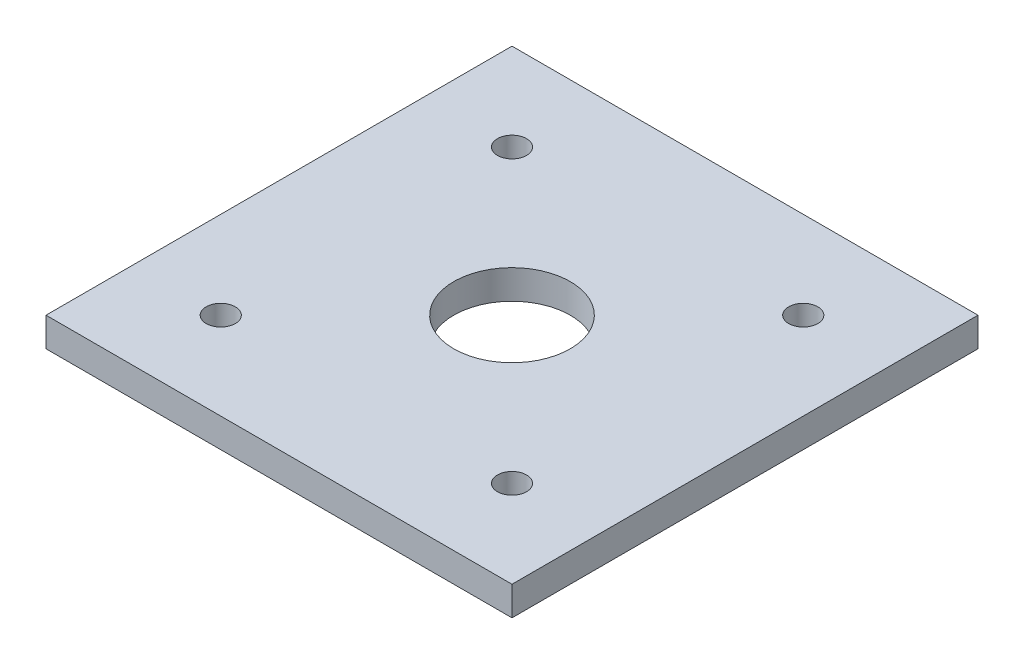
ISO-10303-21;
HEADER;
FILE_DESCRIPTION(('STEP AP214'),'2;1');
FILE_NAME('part.step','',(''),(''),'','','');
FILE_SCHEMA(('AUTOMOTIVE_DESIGN { 1 0 10303 214 1 1 1 1 }'));
ENDSEC;
DATA;
#1=APPLICATION_CONTEXT('core data for automotive mechanical design processes');
#2=APPLICATION_PROTOCOL_DEFINITION('international standard','automotive_design',2000,#1);
#3=PRODUCT_CONTEXT('',#1,'mechanical');
#4=PRODUCT('Part','Part','',(#3));
#5=PRODUCT_RELATED_PRODUCT_CATEGORY('part','',(#4));
#6=PRODUCT_DEFINITION_FORMATION('','',#4);
#7=PRODUCT_DEFINITION_CONTEXT('part definition',#1,'design');
#8=PRODUCT_DEFINITION('design','',#6,#7);
#9=PRODUCT_DEFINITION_SHAPE('','',#8);
#10=(LENGTH_UNIT() NAMED_UNIT(*) SI_UNIT(.MILLI.,.METRE.));
#11=(NAMED_UNIT(*) PLANE_ANGLE_UNIT() SI_UNIT($,.RADIAN.));
#12=(NAMED_UNIT(*) SI_UNIT($,.STERADIAN.) SOLID_ANGLE_UNIT());
#13=UNCERTAINTY_MEASURE_WITH_UNIT(LENGTH_MEASURE(1.E-05),#10,'distance_accuracy_value','');
#14=(GEOMETRIC_REPRESENTATION_CONTEXT(3) GLOBAL_UNCERTAINTY_ASSIGNED_CONTEXT((#13)) GLOBAL_UNIT_ASSIGNED_CONTEXT((#10,
#11,#12)) REPRESENTATION_CONTEXT('',''));
#15=CARTESIAN_POINT('',(0.,0.,0.));
#16=DIRECTION('',(0.,0.,1.));
#17=DIRECTION('',(1.,0.,0.));
#18=AXIS2_PLACEMENT_3D('',#15,#16,#17);
#19=CARTESIAN_POINT('',(0.,6.35,0.));
#20=DIRECTION('',(0.,1.,0.));
#21=DIRECTION('',(0.,0.,1.));
#22=AXIS2_PLACEMENT_3D('',#19,#20,#21);
#23=PLANE('',#22);
#24=CARTESIAN_POINT('',(-31.7500000000003,6.35,-31.7499999999997));
#25=DIRECTION('',(0.,1.,0.));
#26=DIRECTION('',(0.,0.,1.));
#27=AXIS2_PLACEMENT_3D('',#24,#25,#26);
#28=CIRCLE('',#27,3.17499999999999);
#29=CARTESIAN_POINT('',(-31.7500000000003,6.35,-28.5749999999997));
#30=VERTEX_POINT('',#29);
#31=EDGE_CURVE('E137',#30,#30,#28,.T.);
#32=ORIENTED_EDGE('',*,*,#31,.F.);
#33=EDGE_LOOP('',(#32));
#34=FACE_BOUND('',#33,.T.);
#35=CARTESIAN_POINT('',(31.75,6.35,-31.75));
#36=DIRECTION('',(0.,1.,0.));
#37=DIRECTION('',(0.,0.,1.));
#38=AXIS2_PLACEMENT_3D('',#35,#36,#37);
#39=CIRCLE('',#38,3.17499999999998);
#40=CARTESIAN_POINT('',(31.75,6.35,-28.575));
#41=VERTEX_POINT('',#40);
#42=EDGE_CURVE('E131',#41,#41,#39,.T.);
#43=ORIENTED_EDGE('',*,*,#42,.F.);
#44=EDGE_LOOP('',(#43));
#45=FACE_BOUND('',#44,.T.);
#46=CARTESIAN_POINT('',(31.7500000000001,6.35,31.7499999999999));
#47=DIRECTION('',(0.,1.,0.));
#48=DIRECTION('',(0.,0.,1.));
#49=AXIS2_PLACEMENT_3D('',#46,#47,#48);
#50=CIRCLE('',#49,3.17499999999998);
#51=CARTESIAN_POINT('',(31.7500000000001,6.35,34.9249999999999));
#52=VERTEX_POINT('',#51);
#53=EDGE_CURVE('E125',#52,#52,#50,.T.);
#54=ORIENTED_EDGE('',*,*,#53,.F.);
#55=EDGE_LOOP('',(#54));
#56=FACE_BOUND('',#55,.T.);
#57=CARTESIAN_POINT('',(-31.75,6.35,31.75));
#58=DIRECTION('',(0.,1.,0.));
#59=DIRECTION('',(0.,0.,1.));
#60=AXIS2_PLACEMENT_3D('',#57,#58,#59);
#61=CIRCLE('',#60,3.17499999999999);
#62=CARTESIAN_POINT('',(-31.75,6.35,34.925));
#63=VERTEX_POINT('',#62);
#64=EDGE_CURVE('E119',#63,#63,#61,.T.);
#65=ORIENTED_EDGE('',*,*,#64,.F.);
#66=EDGE_LOOP('',(#65));
#67=FACE_BOUND('',#66,.T.);
#68=DIRECTION('',(0.,0.,-1.));
#69=VECTOR('',#68,1.);
#70=CARTESIAN_POINT('',(50.8,6.35,-50.8));
#71=LINE('',#70,#69);
#72=CARTESIAN_POINT('',(50.8,6.35,50.8));
#73=VERTEX_POINT('',#72);
#74=CARTESIAN_POINT('',(50.8,6.35,-50.8));
#75=VERTEX_POINT('',#74);
#76=EDGE_CURVE('E84',#73,#75,#71,.T.);
#77=ORIENTED_EDGE('',*,*,#76,.T.);
#78=DIRECTION('',(-1.,0.,0.));
#79=VECTOR('',#78,1.);
#80=CARTESIAN_POINT('',(-50.8,6.35,-50.8));
#81=LINE('',#80,#79);
#82=CARTESIAN_POINT('',(-50.8,6.35,-50.8));
#83=VERTEX_POINT('',#82);
#84=EDGE_CURVE('E79',#75,#83,#81,.T.);
#85=ORIENTED_EDGE('',*,*,#84,.T.);
#86=DIRECTION('',(0.,0.,1.));
#87=VECTOR('',#86,1.);
#88=CARTESIAN_POINT('',(-50.8,6.35,-50.8));
#89=LINE('',#88,#87);
#90=CARTESIAN_POINT('',(-50.8,6.35,50.8));
#91=VERTEX_POINT('',#90);
#92=EDGE_CURVE('E82',#83,#91,#89,.T.);
#93=ORIENTED_EDGE('',*,*,#92,.T.);
#94=DIRECTION('',(1.,0.,0.));
#95=VECTOR('',#94,1.);
#96=CARTESIAN_POINT('',(-50.8,6.35,50.8));
#97=LINE('',#96,#95);
#98=EDGE_CURVE('E49',#91,#73,#97,.T.);
#99=ORIENTED_EDGE('',*,*,#98,.T.);
#100=EDGE_LOOP('',(#77,#85,#93,#99));
#101=FACE_BOUND('',#100,.T.);
#102=CARTESIAN_POINT('',(0.,6.35,0.));
#103=DIRECTION('',(0.,1.,0.));
#104=DIRECTION('',(0.,0.,1.));
#105=AXIS2_PLACEMENT_3D('',#102,#103,#104);
#106=CIRCLE('',#105,12.7);
#107=CARTESIAN_POINT('',(0.,6.35,12.7));
#108=VERTEX_POINT('',#107);
#109=EDGE_CURVE('E99',#108,#108,#106,.T.);
#110=ORIENTED_EDGE('',*,*,#109,.F.);
#111=EDGE_LOOP('',(#110));
#112=FACE_BOUND('',#111,.T.);
#113=ADVANCED_FACE('F32',(#34,#45,#56,#67,#101,#112),#23,.T.);
#114=CARTESIAN_POINT('',(0.,0.,0.));
#115=DIRECTION('',(0.,1.,0.));
#116=DIRECTION('',(0.,0.,1.));
#117=AXIS2_PLACEMENT_3D('',#114,#115,#116);
#118=PLANE('',#117);
#119=CARTESIAN_POINT('',(-31.7500000000003,0.,-31.7499999999997));
#120=DIRECTION('',(0.,1.,0.));
#121=DIRECTION('',(0.,0.,1.));
#122=AXIS2_PLACEMENT_3D('',#119,#120,#121);
#123=CIRCLE('',#122,3.17499999999999);
#124=CARTESIAN_POINT('',(-31.7500000000003,0.,-28.5749999999997));
#125=VERTEX_POINT('',#124);
#126=EDGE_CURVE('E134',#125,#125,#123,.T.);
#127=ORIENTED_EDGE('',*,*,#126,.T.);
#128=EDGE_LOOP('',(#127));
#129=FACE_BOUND('',#128,.T.);
#130=CARTESIAN_POINT('',(31.75,0.,-31.75));
#131=DIRECTION('',(0.,1.,0.));
#132=DIRECTION('',(0.,0.,1.));
#133=AXIS2_PLACEMENT_3D('',#130,#131,#132);
#134=CIRCLE('',#133,3.17499999999998);
#135=CARTESIAN_POINT('',(31.75,0.,-28.575));
#136=VERTEX_POINT('',#135);
#137=EDGE_CURVE('E128',#136,#136,#134,.T.);
#138=ORIENTED_EDGE('',*,*,#137,.T.);
#139=EDGE_LOOP('',(#138));
#140=FACE_BOUND('',#139,.T.);
#141=CARTESIAN_POINT('',(31.7500000000001,0.,31.7499999999999));
#142=DIRECTION('',(0.,1.,0.));
#143=DIRECTION('',(0.,0.,1.));
#144=AXIS2_PLACEMENT_3D('',#141,#142,#143);
#145=CIRCLE('',#144,3.17499999999998);
#146=CARTESIAN_POINT('',(31.7500000000001,0.,34.9249999999999));
#147=VERTEX_POINT('',#146);
#148=EDGE_CURVE('E122',#147,#147,#145,.T.);
#149=ORIENTED_EDGE('',*,*,#148,.T.);
#150=EDGE_LOOP('',(#149));
#151=FACE_BOUND('',#150,.T.);
#152=CARTESIAN_POINT('',(-31.75,0.,31.75));
#153=DIRECTION('',(0.,1.,0.));
#154=DIRECTION('',(0.,0.,1.));
#155=AXIS2_PLACEMENT_3D('',#152,#153,#154);
#156=CIRCLE('',#155,3.17499999999999);
#157=CARTESIAN_POINT('',(-31.75,0.,34.925));
#158=VERTEX_POINT('',#157);
#159=EDGE_CURVE('E114',#158,#158,#156,.T.);
#160=ORIENTED_EDGE('',*,*,#159,.T.);
#161=EDGE_LOOP('',(#160));
#162=FACE_BOUND('',#161,.T.);
#163=DIRECTION('',(0.,0.,-1.));
#164=VECTOR('',#163,1.);
#165=CARTESIAN_POINT('',(50.8,0.,-50.8));
#166=LINE('',#165,#164);
#167=CARTESIAN_POINT('',(50.8,0.,50.8));
#168=VERTEX_POINT('',#167);
#169=CARTESIAN_POINT('',(50.8,0.,-50.8));
#170=VERTEX_POINT('',#169);
#171=EDGE_CURVE('E96',#168,#170,#166,.T.);
#172=ORIENTED_EDGE('',*,*,#171,.F.);
#173=DIRECTION('',(1.,0.,0.));
#174=VECTOR('',#173,1.);
#175=CARTESIAN_POINT('',(-50.8,0.,50.8));
#176=LINE('',#175,#174);
#177=CARTESIAN_POINT('',(-50.8,0.,50.8));
#178=VERTEX_POINT('',#177);
#179=EDGE_CURVE('E72',#178,#168,#176,.T.);
#180=ORIENTED_EDGE('',*,*,#179,.F.);
#181=DIRECTION('',(0.,0.,1.));
#182=VECTOR('',#181,1.);
#183=CARTESIAN_POINT('',(-50.8,0.,-50.8));
#184=LINE('',#183,#182);
#185=CARTESIAN_POINT('',(-50.8,0.,-50.8));
#186=VERTEX_POINT('',#185);
#187=EDGE_CURVE('E66',#186,#178,#184,.T.);
#188=ORIENTED_EDGE('',*,*,#187,.F.);
#189=DIRECTION('',(-1.,0.,0.));
#190=VECTOR('',#189,1.);
#191=CARTESIAN_POINT('',(-50.8,0.,-50.8));
#192=LINE('',#191,#190);
#193=EDGE_CURVE('E88',#170,#186,#192,.T.);
#194=ORIENTED_EDGE('',*,*,#193,.F.);
#195=EDGE_LOOP('',(#172,#180,#188,#194));
#196=FACE_BOUND('',#195,.T.);
#197=CARTESIAN_POINT('',(0.,0.,0.));
#198=DIRECTION('',(0.,1.,0.));
#199=DIRECTION('',(0.,0.,1.));
#200=AXIS2_PLACEMENT_3D('',#197,#198,#199);
#201=CIRCLE('',#200,12.7);
#202=CARTESIAN_POINT('',(0.,0.,12.7));
#203=VERTEX_POINT('',#202);
#204=EDGE_CURVE('E111',#203,#203,#201,.T.);
#205=ORIENTED_EDGE('',*,*,#204,.T.);
#206=EDGE_LOOP('',(#205));
#207=FACE_BOUND('',#206,.T.);
#208=ADVANCED_FACE('F107',(#129,#140,#151,#162,#196,#207),#118,.F.);
#209=CARTESIAN_POINT('',(50.8,6.35,-50.8));
#210=DIRECTION('',(-1.,0.,0.));
#211=DIRECTION('',(0.,0.,1.));
#212=AXIS2_PLACEMENT_3D('',#209,#210,#211);
#213=PLANE('',#212);
#214=ORIENTED_EDGE('',*,*,#171,.T.);
#215=DIRECTION('',(0.,-1.,0.));
#216=VECTOR('',#215,1.);
#217=CARTESIAN_POINT('',(50.8,6.35,-50.8));
#218=LINE('',#217,#216);
#219=EDGE_CURVE('E11',#75,#170,#218,.T.);
#220=ORIENTED_EDGE('',*,*,#219,.F.);
#221=ORIENTED_EDGE('',*,*,#76,.F.);
#222=DIRECTION('',(0.,-1.,0.));
#223=VECTOR('',#222,1.);
#224=CARTESIAN_POINT('',(50.8,6.35,50.8));
#225=LINE('',#224,#223);
#226=EDGE_CURVE('E92',#73,#168,#225,.T.);
#227=ORIENTED_EDGE('',*,*,#226,.T.);
#228=EDGE_LOOP('',(#214,#220,#221,#227));
#229=FACE_BOUND('',#228,.T.);
#230=ADVANCED_FACE('F34',(#229),#213,.F.);
#231=CARTESIAN_POINT('',(-50.8,6.35,-50.8));
#232=DIRECTION('',(0.,0.,1.));
#233=DIRECTION('',(1.,0.,0.));
#234=AXIS2_PLACEMENT_3D('',#231,#232,#233);
#235=PLANE('',#234);
#236=ORIENTED_EDGE('',*,*,#193,.T.);
#237=DIRECTION('',(0.,-1.,0.));
#238=VECTOR('',#237,1.);
#239=CARTESIAN_POINT('',(-50.8,6.35,-50.8));
#240=LINE('',#239,#238);
#241=EDGE_CURVE('E41',#83,#186,#240,.T.);
#242=ORIENTED_EDGE('',*,*,#241,.F.);
#243=ORIENTED_EDGE('',*,*,#84,.F.);
#244=ORIENTED_EDGE('',*,*,#219,.T.);
#245=EDGE_LOOP('',(#236,#242,#243,#244));
#246=FACE_BOUND('',#245,.T.);
#247=ADVANCED_FACE('F87',(#246),#235,.F.);
#248=CARTESIAN_POINT('',(-50.8,6.35,-50.8));
#249=DIRECTION('',(1.,0.,0.));
#250=DIRECTION('',(0.,0.,-1.));
#251=AXIS2_PLACEMENT_3D('',#248,#249,#250);
#252=PLANE('',#251);
#253=ORIENTED_EDGE('',*,*,#187,.T.);
#254=DIRECTION('',(0.,-1.,0.));
#255=VECTOR('',#254,1.);
#256=CARTESIAN_POINT('',(-50.8,6.35,50.8));
#257=LINE('',#256,#255);
#258=EDGE_CURVE('E89',#91,#178,#257,.T.);
#259=ORIENTED_EDGE('',*,*,#258,.F.);
#260=ORIENTED_EDGE('',*,*,#92,.F.);
#261=ORIENTED_EDGE('',*,*,#241,.T.);
#262=EDGE_LOOP('',(#253,#259,#260,#261));
#263=FACE_BOUND('',#262,.T.);
#264=ADVANCED_FACE('F90',(#263),#252,.F.);
#265=CARTESIAN_POINT('',(-50.8,6.35,50.8));
#266=DIRECTION('',(0.,0.,-1.));
#267=DIRECTION('',(-1.,0.,0.));
#268=AXIS2_PLACEMENT_3D('',#265,#266,#267);
#269=PLANE('',#268);
#270=ORIENTED_EDGE('',*,*,#179,.T.);
#271=ORIENTED_EDGE('',*,*,#226,.F.);
#272=ORIENTED_EDGE('',*,*,#98,.F.);
#273=ORIENTED_EDGE('',*,*,#258,.T.);
#274=EDGE_LOOP('',(#270,#271,#272,#273));
#275=FACE_BOUND('',#274,.T.);
#276=ADVANCED_FACE('F104',(#275),#269,.F.);
#277=CARTESIAN_POINT('',(0.,6.35,0.));
#278=DIRECTION('',(0.,-1.,0.));
#279=DIRECTION('',(0.,0.,-1.));
#280=AXIS2_PLACEMENT_3D('',#277,#278,#279);
#281=CYLINDRICAL_SURFACE('',#280,12.7);
#282=ORIENTED_EDGE('',*,*,#109,.T.);
#283=EDGE_LOOP('',(#282));
#284=FACE_BOUND('',#283,.T.);
#285=ORIENTED_EDGE('',*,*,#204,.F.);
#286=EDGE_LOOP('',(#285));
#287=FACE_BOUND('',#286,.T.);
#288=ADVANCED_FACE('F155',(#284,#287),#281,.F.);
#289=CARTESIAN_POINT('',(-31.75,6.35,31.75));
#290=DIRECTION('',(0.,1.,0.));
#291=DIRECTION('',(0.,0.,1.));
#292=AXIS2_PLACEMENT_3D('',#289,#290,#291);
#293=CYLINDRICAL_SURFACE('',#292,3.17499999999999);
#294=ORIENTED_EDGE('',*,*,#159,.F.);
#295=EDGE_LOOP('',(#294));
#296=FACE_BOUND('',#295,.T.);
#297=ORIENTED_EDGE('',*,*,#64,.T.);
#298=EDGE_LOOP('',(#297));
#299=FACE_BOUND('',#298,.T.);
#300=ADVANCED_FACE('F152',(#296,#299),#293,.F.);
#301=CARTESIAN_POINT('',(31.7500000000001,6.35,31.7499999999999));
#302=DIRECTION('',(0.,1.,0.));
#303=DIRECTION('',(0.,0.,1.));
#304=AXIS2_PLACEMENT_3D('',#301,#302,#303);
#305=CYLINDRICAL_SURFACE('',#304,3.17499999999998);
#306=ORIENTED_EDGE('',*,*,#148,.F.);
#307=EDGE_LOOP('',(#306));
#308=FACE_BOUND('',#307,.T.);
#309=ORIENTED_EDGE('',*,*,#53,.T.);
#310=EDGE_LOOP('',(#309));
#311=FACE_BOUND('',#310,.T.);
#312=ADVANCED_FACE('F154',(#308,#311),#305,.F.);
#313=CARTESIAN_POINT('',(31.75,6.35,-31.75));
#314=DIRECTION('',(0.,1.,0.));
#315=DIRECTION('',(0.,0.,1.));
#316=AXIS2_PLACEMENT_3D('',#313,#314,#315);
#317=CYLINDRICAL_SURFACE('',#316,3.17499999999998);
#318=ORIENTED_EDGE('',*,*,#137,.F.);
#319=EDGE_LOOP('',(#318));
#320=FACE_BOUND('',#319,.T.);
#321=ORIENTED_EDGE('',*,*,#42,.T.);
#322=EDGE_LOOP('',(#321));
#323=FACE_BOUND('',#322,.T.);
#324=ADVANCED_FACE('F162',(#320,#323),#317,.F.);
#325=CARTESIAN_POINT('',(-31.7500000000003,6.35,-31.7499999999997));
#326=DIRECTION('',(0.,1.,0.));
#327=DIRECTION('',(0.,0.,1.));
#328=AXIS2_PLACEMENT_3D('',#325,#326,#327);
#329=CYLINDRICAL_SURFACE('',#328,3.17499999999999);
#330=ORIENTED_EDGE('',*,*,#126,.F.);
#331=EDGE_LOOP('',(#330));
#332=FACE_BOUND('',#331,.T.);
#333=ORIENTED_EDGE('',*,*,#31,.T.);
#334=EDGE_LOOP('',(#333));
#335=FACE_BOUND('',#334,.T.);
#336=ADVANCED_FACE('F141',(#332,#335),#329,.F.);
#337=CLOSED_SHELL('',(#113,#208,#230,#247,#264,#276,#288,#300,#312,#324,#336));
#338=MANIFOLD_SOLID_BREP('B2',#337);
#339=ADVANCED_BREP_SHAPE_REPRESENTATION('',(#18,#338),#14);
#340=SHAPE_DEFINITION_REPRESENTATION(#9,#339);
ENDSEC;
END-ISO-10303-21;
